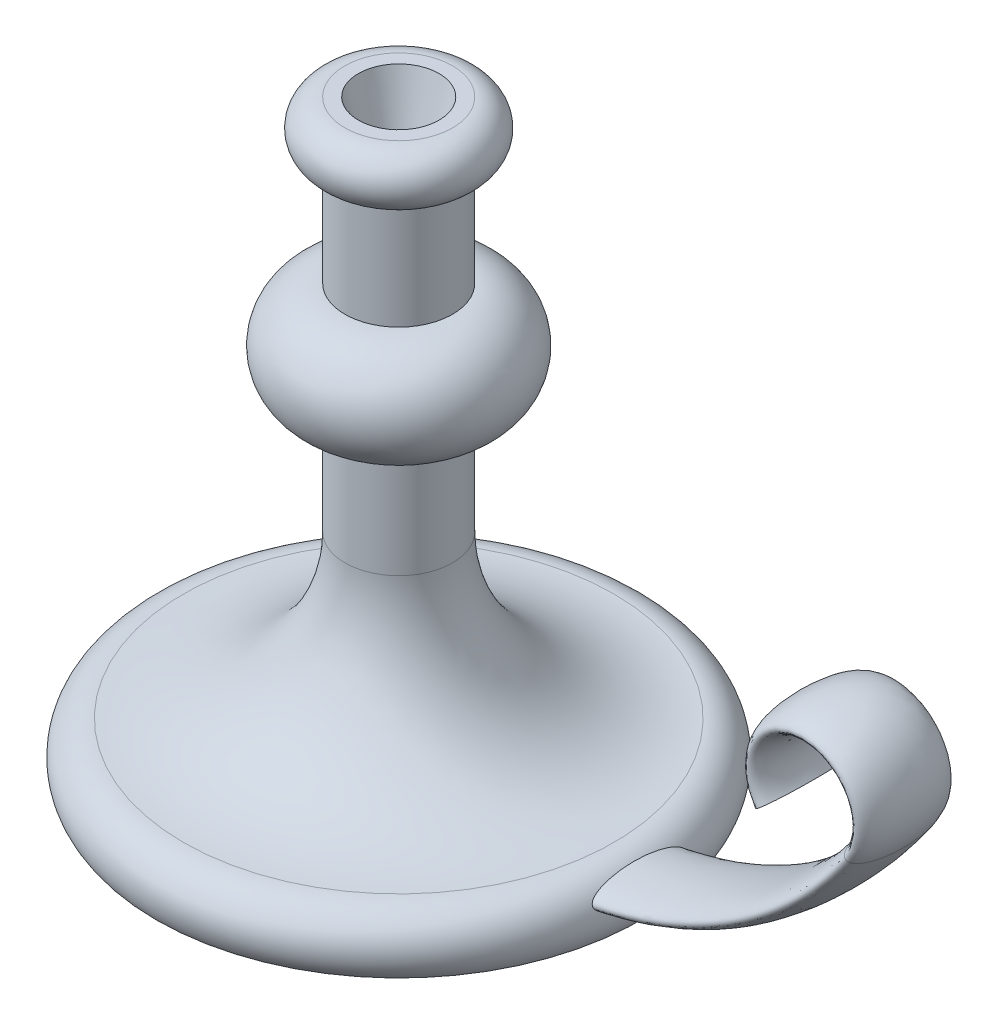
ISO-10303-21;
HEADER;
FILE_DESCRIPTION(('STEP AP214'),'2;1');
FILE_NAME('part.step','',(''),(''),'','','');
FILE_SCHEMA(('AUTOMOTIVE_DESIGN { 1 0 10303 214 1 1 1 1 }'));
ENDSEC;
DATA;
#1=APPLICATION_CONTEXT('core data for automotive mechanical design processes');
#2=APPLICATION_PROTOCOL_DEFINITION('international standard','automotive_design',2000,#1);
#3=PRODUCT_CONTEXT('',#1,'mechanical');
#4=PRODUCT('Part','Part','',(#3));
#5=PRODUCT_RELATED_PRODUCT_CATEGORY('part','',(#4));
#6=PRODUCT_DEFINITION_FORMATION('','',#4);
#7=PRODUCT_DEFINITION_CONTEXT('part definition',#1,'design');
#8=PRODUCT_DEFINITION('design','',#6,#7);
#9=PRODUCT_DEFINITION_SHAPE('','',#8);
#10=(LENGTH_UNIT() NAMED_UNIT(*) SI_UNIT(.MILLI.,.METRE.));
#11=(NAMED_UNIT(*) PLANE_ANGLE_UNIT() SI_UNIT($,.RADIAN.));
#12=(NAMED_UNIT(*) SI_UNIT($,.STERADIAN.) SOLID_ANGLE_UNIT());
#13=UNCERTAINTY_MEASURE_WITH_UNIT(LENGTH_MEASURE(1.E-05),#10,'distance_accuracy_value','');
#14=(GEOMETRIC_REPRESENTATION_CONTEXT(3) GLOBAL_UNCERTAINTY_ASSIGNED_CONTEXT((#13)) GLOBAL_UNIT_ASSIGNED_CONTEXT((#10,
#11,#12)) REPRESENTATION_CONTEXT('',''));
#15=CARTESIAN_POINT('',(0.,0.,0.));
#16=DIRECTION('',(0.,0.,1.));
#17=DIRECTION('',(1.,0.,0.));
#18=AXIS2_PLACEMENT_3D('',#15,#16,#17);
#19=CARTESIAN_POINT('',(0.,0.,0.));
#20=DIRECTION('',(0.,-1.,0.));
#21=DIRECTION('',(0.,0.,-1.));
#22=AXIS2_PLACEMENT_3D('',#19,#20,#21);
#23=PLANE('',#22);
#24=CARTESIAN_POINT('',(0.,0.,0.));
#25=DIRECTION('',(0.,-1.,0.));
#26=DIRECTION('',(0.,0.,-1.));
#27=AXIS2_PLACEMENT_3D('',#24,#25,#26);
#28=CIRCLE('',#27,90.);
#29=CARTESIAN_POINT('',(0.,0.,-90.));
#30=VERTEX_POINT('',#29);
#31=EDGE_CURVE('E82',#30,#30,#28,.T.);
#32=ORIENTED_EDGE('',*,*,#31,.T.);
#33=EDGE_LOOP('',(#32));
#34=FACE_BOUND('',#33,.T.);
#35=ADVANCED_FACE('F42',(#34),#23,.T.);
#36=CARTESIAN_POINT('',(0.,220.,0.));
#37=DIRECTION('',(0.,1.,0.));
#38=DIRECTION('',(0.,0.,1.));
#39=AXIS2_PLACEMENT_3D('',#36,#37,#38);
#40=PLANE('',#39);
#41=CARTESIAN_POINT('',(0.,220.,0.));
#42=DIRECTION('',(0.,1.,0.));
#43=DIRECTION('',(0.,0.,1.));
#44=AXIS2_PLACEMENT_3D('',#41,#42,#43);
#45=CIRCLE('',#44,15.);
#46=CARTESIAN_POINT('',(0.,220.,15.));
#47=VERTEX_POINT('',#46);
#48=EDGE_CURVE('E98',#47,#47,#45,.T.);
#49=ORIENTED_EDGE('',*,*,#48,.F.);
#50=EDGE_LOOP('',(#49));
#51=FACE_BOUND('',#50,.T.);
#52=CARTESIAN_POINT('',(0.,220.,0.));
#53=DIRECTION('',(0.,-1.,0.));
#54=DIRECTION('',(0.,0.,-1.));
#55=AXIS2_PLACEMENT_3D('',#52,#53,#54);
#56=CIRCLE('',#55,20.);
#57=CARTESIAN_POINT('',(0.,220.,-20.));
#58=VERTEX_POINT('',#57);
#59=EDGE_CURVE('E54',#58,#58,#56,.T.);
#60=ORIENTED_EDGE('',*,*,#59,.F.);
#61=EDGE_LOOP('',(#60));
#62=FACE_BOUND('',#61,.T.);
#63=ADVANCED_FACE('F105',(#51,#62),#40,.T.);
#64=CARTESIAN_POINT('',(0.,210.,0.));
#65=DIRECTION('',(0.,-1.,0.));
#66=DIRECTION('',(0.,0.,-1.));
#67=AXIS2_PLACEMENT_3D('',#64,#65,#66);
#68=TOROIDAL_SURFACE('',#67,20.,10.);
#69=ORIENTED_EDGE('',*,*,#59,.T.);
#70=EDGE_LOOP('',(#69));
#71=FACE_BOUND('',#70,.T.);
#72=CARTESIAN_POINT('',(0.,200.,0.));
#73=DIRECTION('',(0.,-1.,0.));
#74=DIRECTION('',(0.,0.,-1.));
#75=AXIS2_PLACEMENT_3D('',#72,#73,#74);
#76=CIRCLE('',#75,20.);
#77=CARTESIAN_POINT('',(0.,200.,-20.));
#78=VERTEX_POINT('',#77);
#79=EDGE_CURVE('E59',#78,#78,#76,.T.);
#80=ORIENTED_EDGE('',*,*,#79,.F.);
#81=EDGE_LOOP('',(#80));
#82=FACE_BOUND('',#81,.T.);
#83=ADVANCED_FACE('F108',(#71,#82),#68,.T.);
#84=CARTESIAN_POINT('',(0.,0.,0.));
#85=DIRECTION('',(0.,-1.,0.));
#86=DIRECTION('',(0.,0.,-1.));
#87=AXIS2_PLACEMENT_3D('',#84,#85,#86);
#88=CYLINDRICAL_SURFACE('',#87,20.);
#89=ORIENTED_EDGE('',*,*,#79,.T.);
#90=EDGE_LOOP('',(#89));
#91=FACE_BOUND('',#90,.T.);
#92=CARTESIAN_POINT('',(0.,160.,0.));
#93=DIRECTION('',(0.,-1.,0.));
#94=DIRECTION('',(0.,0.,-1.));
#95=AXIS2_PLACEMENT_3D('',#92,#93,#94);
#96=CIRCLE('',#95,20.);
#97=CARTESIAN_POINT('',(0.,160.,-20.));
#98=VERTEX_POINT('',#97);
#99=EDGE_CURVE('E64',#98,#98,#96,.T.);
#100=ORIENTED_EDGE('',*,*,#99,.F.);
#101=EDGE_LOOP('',(#100));
#102=FACE_BOUND('',#101,.T.);
#103=ADVANCED_FACE('F114',(#91,#102),#88,.T.);
#104=CARTESIAN_POINT('',(0.,140.,0.));
#105=DIRECTION('',(0.,-1.,0.));
#106=DIRECTION('',(0.,0.,-1.));
#107=AXIS2_PLACEMENT_3D('',#104,#105,#106);
#108=DEGENERATE_TOROIDAL_SURFACE('',#107,20.,20.,.T.);
#109=ORIENTED_EDGE('',*,*,#99,.T.);
#110=EDGE_LOOP('',(#109));
#111=FACE_BOUND('',#110,.T.);
#112=CARTESIAN_POINT('',(0.,120.,0.));
#113=DIRECTION('',(0.,-1.,0.));
#114=DIRECTION('',(0.,0.,-1.));
#115=AXIS2_PLACEMENT_3D('',#112,#113,#114);
#116=CIRCLE('',#115,20.);
#117=CARTESIAN_POINT('',(0.,120.,-20.));
#118=VERTEX_POINT('',#117);
#119=EDGE_CURVE('E70',#118,#118,#116,.T.);
#120=ORIENTED_EDGE('',*,*,#119,.F.);
#121=EDGE_LOOP('',(#120));
#122=FACE_BOUND('',#121,.T.);
#123=ADVANCED_FACE('F121',(#111,#122),#108,.T.);
#124=CARTESIAN_POINT('',(0.,0.,0.));
#125=DIRECTION('',(0.,-1.,0.));
#126=DIRECTION('',(0.,0.,-1.));
#127=AXIS2_PLACEMENT_3D('',#124,#125,#126);
#128=CYLINDRICAL_SURFACE('',#127,20.);
#129=ORIENTED_EDGE('',*,*,#119,.T.);
#130=EDGE_LOOP('',(#129));
#131=FACE_BOUND('',#130,.T.);
#132=CARTESIAN_POINT('',(0.,79.9999999999999,0.));
#133=DIRECTION('',(0.,-1.,0.));
#134=DIRECTION('',(0.,0.,-1.));
#135=AXIS2_PLACEMENT_3D('',#132,#133,#134);
#136=CIRCLE('',#135,20.);
#137=CARTESIAN_POINT('',(0.,79.9999999999999,-20.));
#138=VERTEX_POINT('',#137);
#139=EDGE_CURVE('E74',#138,#138,#136,.T.);
#140=ORIENTED_EDGE('',*,*,#139,.F.);
#141=EDGE_LOOP('',(#140));
#142=FACE_BOUND('',#141,.T.);
#143=ADVANCED_FACE('F125',(#131,#142),#128,.T.);
#144=CARTESIAN_POINT('',(0.,79.9999999999999,0.));
#145=DIRECTION('',(0.,-1.,0.));
#146=DIRECTION('',(0.,0.,-1.));
#147=AXIS2_PLACEMENT_3D('',#144,#145,#146);
#148=TOROIDAL_SURFACE('',#147,80.,60.);
#149=ORIENTED_EDGE('',*,*,#139,.T.);
#150=EDGE_LOOP('',(#149));
#151=FACE_BOUND('',#150,.T.);
#152=CARTESIAN_POINT('',(0.,19.9999999999999,0.));
#153=DIRECTION('',(0.,-1.,0.));
#154=DIRECTION('',(0.,0.,-1.));
#155=AXIS2_PLACEMENT_3D('',#152,#153,#154);
#156=CIRCLE('',#155,80.0000000000002);
#157=CARTESIAN_POINT('',(0.,19.9999999999999,-80.0000000000002));
#158=VERTEX_POINT('',#157);
#159=EDGE_CURVE('E78',#158,#158,#156,.T.);
#160=ORIENTED_EDGE('',*,*,#159,.F.);
#161=EDGE_LOOP('',(#160));
#162=FACE_BOUND('',#161,.T.);
#163=ADVANCED_FACE('F129',(#151,#162),#148,.F.);
#164=CARTESIAN_POINT('',(0.,7.50000000000012,0.));
#165=DIRECTION('',(0.,-1.,0.));
#166=DIRECTION('',(0.,0.,-1.));
#167=AXIS2_PLACEMENT_3D('',#164,#165,#166);
#168=TOROIDAL_SURFACE('',#167,80.0000000000003,12.4999999999998);
#169=CARTESIAN_POINT('',(89.5597422043343,12.9414346567556,-17.5));
#170=CARTESIAN_POINT('',(89.5390618403563,12.9834100865229,-17.4999996776707));
#171=CARTESIAN_POINT('',(89.5184817634661,13.0254349004938,-17.4978446678338));
#172=CARTESIAN_POINT('',(89.4776811982745,13.1092324497794,-17.4892861575811));
#173=CARTESIAN_POINT('',(89.4574608430712,13.1510050881611,-17.4828811168849));
#174=CARTESIAN_POINT('',(89.3975402811211,13.2754779151414,-17.4575154450276));
#175=CARTESIAN_POINT('',(89.3585808220615,13.357332519418,-17.4324042670614));
#176=CARTESIAN_POINT('',(89.273440780437,13.537917999339,-17.3597430943198));
#177=CARTESIAN_POINT('',(89.2281116968575,13.6353152430682,-17.3079906529225));
#178=CARTESIAN_POINT('',(89.1421567137611,13.821757010941,-17.1881654215547));
#179=CARTESIAN_POINT('',(89.1015409681602,13.9107834263932,-17.1200583326704));
#180=CARTESIAN_POINT('',(89.0298799325307,14.0690063055582,-16.9825317839868));
#181=CARTESIAN_POINT('',(88.9982856031082,14.1392491335227,-16.9145677994464));
#182=CARTESIAN_POINT('',(88.9378435588023,14.2742914925202,-16.7722502997375));
#183=CARTESIAN_POINT('',(88.9089980734783,14.3390866000317,-16.6978916893925));
#184=CARTESIAN_POINT('',(88.8536099995595,14.4639626152392,-16.5442177801531));
#185=CARTESIAN_POINT('',(88.8270733532938,14.5240313225779,-16.4648905452803));
#186=CARTESIAN_POINT('',(88.7760376587065,14.6398576639347,-16.3025863942461));
#187=CARTESIAN_POINT('',(88.751537961323,14.6956166708123,-16.2196106536441));
#188=CARTESIAN_POINT('',(88.7047328205491,14.8023169553036,-16.052427362784));
#189=CARTESIAN_POINT('',(88.6823939519367,14.8533308765833,-15.9682752160745));
#190=CARTESIAN_POINT('',(88.6391553657591,14.9521540950118,-15.7977416210759));
#191=CARTESIAN_POINT('',(88.6182558899723,14.9999628537459,-15.711359801597));
#192=CARTESIAN_POINT('',(88.557368179001,15.1392585624724,-15.4492483073625));
#193=CARTESIAN_POINT('',(88.5192579811329,15.2264609786255,-15.2707999543232));
#194=CARTESIAN_POINT('',(88.4468979005837,15.3916731276291,-14.9088289385944));
#195=CARTESIAN_POINT('',(88.4126513155028,15.4696750103546,-14.725302105289));
#196=CARTESIAN_POINT('',(88.3471391595041,15.6182965032923,-14.3538259785736));
#197=CARTESIAN_POINT('',(88.3158872528147,15.6888824046966,-14.1658608782526));
#198=CARTESIAN_POINT('',(88.2560127035518,15.8233792512431,-13.7874003918539));
#199=CARTESIAN_POINT('',(88.2273872233004,15.8872974109118,-13.5969079973402));
#200=CARTESIAN_POINT('',(88.172334882745,16.0094159388249,-13.213849673779));
#201=CARTESIAN_POINT('',(88.1459074726897,16.0676177374301,-13.021284276893));
#202=CARTESIAN_POINT('',(88.0884248304703,16.1932687928886,-12.5849658119247));
#203=CARTESIAN_POINT('',(88.0579162002185,16.2592725226906,-12.3407253521734));
#204=CARTESIAN_POINT('',(87.9994625659015,16.3844358500306,-11.8501803460781));
#205=CARTESIAN_POINT('',(87.971517823409,16.4435947494062,-11.6038755919222));
#206=CARTESIAN_POINT('',(87.9178897421859,16.5558889779776,-11.1095299870479));
#207=CARTESIAN_POINT('',(87.892207511427,16.6090213595568,-10.8614883492399));
#208=CARTESIAN_POINT('',(87.8429155378604,16.7098546386226,-10.3640943607017));
#209=CARTESIAN_POINT('',(87.8193058942813,16.7575552760879,-10.114741947821));
#210=CARTESIAN_POINT('',(87.7514718906048,16.8930622945828,-9.36631396644894));
#211=CARTESIAN_POINT('',(87.7101114199142,16.97354616682,-8.86564202060308));
#212=CARTESIAN_POINT('',(87.6344118706355,17.1178657179369,-7.86153551840223));
#213=CARTESIAN_POINT('',(87.6000713341081,17.181704854449,-7.35810155802558));
#214=CARTESIAN_POINT('',(87.5383679228556,17.2943697092708,-6.35225136111868));
#215=CARTESIAN_POINT('',(87.510963905082,17.3432843238913,-5.84984753787551));
#216=CARTESIAN_POINT('',(87.4628391630612,17.4279603163538,-4.84354228831006));
#217=CARTESIAN_POINT('',(87.4421195253374,17.4637195559667,-4.33964063194085));
#218=CARTESIAN_POINT('',(87.4074386787956,17.5229738360405,-3.33084363886009));
#219=CARTESIAN_POINT('',(87.3934780874883,17.5464677559496,-2.82594821558677));
#220=CARTESIAN_POINT('',(87.3724154174236,17.5817273168609,-1.81615213380799));
#221=CARTESIAN_POINT('',(87.365305974734,17.5935055508652,-1.31125206554517));
#222=CARTESIAN_POINT('',(87.3579750479626,17.605648406649,-0.30131830913287));
#223=CARTESIAN_POINT('',(87.3577528582351,17.6060141977103,0.203715360026129));
#224=CARTESIAN_POINT('',(87.364196342644,17.5953454261039,1.21356726554173));
#225=CARTESIAN_POINT('',(87.3708612610897,17.5843121142069,1.71838551945512));
#226=CARTESIAN_POINT('',(87.3886163883339,17.5546163065411,2.60695068649856));
#227=CARTESIAN_POINT('',(87.3982690399214,17.5384060734754,2.99081046478842));
#228=CARTESIAN_POINT('',(87.4214966880661,17.4990063104014,3.75807002785715));
#229=CARTESIAN_POINT('',(87.4350718235982,17.4758165331044,4.14146979585431));
#230=CARTESIAN_POINT('',(87.4661109016123,17.4221255760208,4.90767543763212));
#231=CARTESIAN_POINT('',(87.4835755913651,17.3916229911934,5.29048118303762));
#232=CARTESIAN_POINT('',(87.5224765269601,17.3226675403927,6.05728766608039));
#233=CARTESIAN_POINT('',(87.5439339089185,17.2841722314847,6.44128353835444));
#234=CARTESIAN_POINT('',(87.5907685418078,17.1987228636429,7.20803081067559));
#235=CARTESIAN_POINT('',(87.6161451191907,17.1517702579396,7.59078241304233));
#236=CARTESIAN_POINT('',(87.670887524493,17.0486132676473,8.35453102594117));
#237=CARTESIAN_POINT('',(87.7002509792865,16.9924143825779,8.73552894189138));
#238=CARTESIAN_POINT('',(87.7555693385743,16.8844873931685,9.40362807317348));
#239=CARTESIAN_POINT('',(87.7806318626292,16.8349635590469,9.69115955865564));
#240=CARTESIAN_POINT('',(87.8333287645209,16.7293167465829,10.2648242071223));
#241=CARTESIAN_POINT('',(87.8609635304673,16.6731927720484,10.5509571522123));
#242=CARTESIAN_POINT('',(87.919067813825,16.5534902310351,11.1217112831612));
#243=CARTESIAN_POINT('',(87.9495404231885,16.4899035134826,11.4063304543325));
#244=CARTESIAN_POINT('',(88.0137266324377,16.3541216812727,11.9738772339477));
#245=CARTESIAN_POINT('',(88.0474477220509,16.2819065762202,12.2567992545898));
#246=CARTESIAN_POINT('',(88.1183718381955,16.1280994435204,12.8175821097588));
#247=CARTESIAN_POINT('',(88.1555499028385,16.046573796357,13.0954641920682));
#248=CARTESIAN_POINT('',(88.2343580118386,15.8719007074314,13.6468218234687));
#249=CARTESIAN_POINT('',(88.275985729586,15.7787593350285,13.9202995902182));
#250=CARTESIAN_POINT('',(88.3426568223941,15.628384040649,14.3254052817092));
#251=CARTESIAN_POINT('',(88.3655500017786,15.5765627213432,14.4594023169281));
#252=CARTESIAN_POINT('',(88.4129882653634,15.4688611687535,14.7254525655375));
#253=CARTESIAN_POINT('',(88.4375331689952,15.4129813790936,14.8575059894887));
#254=CARTESIAN_POINT('',(88.4884967907574,15.2967269720351,15.1188747284344));
#255=CARTESIAN_POINT('',(88.514910912316,15.2363633637366,15.248195809858));
#256=CARTESIAN_POINT('',(88.5700241751773,15.1103179001212,15.5037035642082));
#257=CARTESIAN_POINT('',(88.5987227483178,15.0446373670989,15.6298910063173));
#258=CARTESIAN_POINT('',(88.6570151826479,14.9113179601609,15.8704199707059));
#259=CARTESIAN_POINT('',(88.6864417367862,14.8440563407289,15.9850095995261));
#260=CARTESIAN_POINT('',(88.7482816567769,14.7030103830827,16.2094581395952));
#261=CARTESIAN_POINT('',(88.7806974756142,14.6292206899981,16.3193130551169));
#262=CARTESIAN_POINT('',(88.8489097184973,14.4745639616531,16.5315146626623));
#263=CARTESIAN_POINT('',(88.8846785573509,14.3937550191611,16.6339121024916));
#264=CARTESIAN_POINT('',(88.9606113704154,14.2232561160767,16.8291907541922));
#265=CARTESIAN_POINT('',(89.0007675950255,14.1335818404865,16.9220882016583));
#266=CARTESIAN_POINT('',(89.0601235459874,14.0021924630805,17.0411637727684));
#267=CARTESIAN_POINT('',(89.0770574086406,13.9648250339927,17.073294917827));
#268=CARTESIAN_POINT('',(89.111770404309,13.8885105828123,17.1351129203988));
#269=CARTESIAN_POINT('',(89.1295494802,13.8495636674962,17.1647999427301));
#270=CARTESIAN_POINT('',(89.1842722230349,13.7301865324198,17.2496672583031));
#271=CARTESIAN_POINT('',(89.2225929343978,13.6472387371287,17.3006362954167));
#272=CARTESIAN_POINT('',(89.2830198855206,13.5177923286577,17.3659392171784));
#273=CARTESIAN_POINT('',(89.3038035106327,13.4734899832391,17.385944655127));
#274=CARTESIAN_POINT('',(89.3462357272132,13.3835498526412,17.421521231844));
#275=CARTESIAN_POINT('',(89.3678838017237,13.3379128698458,17.4370949768747));
#276=CARTESIAN_POINT('',(89.4119048024241,13.2456714845448,17.4633118273198));
#277=CARTESIAN_POINT('',(89.4342765183817,13.1990687398024,17.4739627514632));
#278=CARTESIAN_POINT('',(89.4796070415908,13.1052444737537,17.4900003628641));
#279=CARTESIAN_POINT('',(89.502565762481,13.0580230439623,17.495387819971));
#280=CARTESIAN_POINT('',(89.546427171602,12.9684112208445,17.5004320668286));
#281=CARTESIAN_POINT('',(89.5672934245653,12.9260327119427,17.5006298436875));
#282=CARTESIAN_POINT('',(89.6091580078858,12.8415284156484,17.496667300483));
#283=CARTESIAN_POINT('',(89.630156379747,12.7994027167222,17.4925055351934));
#284=CARTESIAN_POINT('',(89.6721156351432,12.7157496198108,17.479965082583));
#285=CARTESIAN_POINT('',(89.693076501433,12.6742224548789,17.4715847960013));
#286=CARTESIAN_POINT('',(89.7348115258835,12.5920532516239,17.450862522026));
#287=CARTESIAN_POINT('',(89.7555855765782,12.5514117057389,17.4385183877269));
#288=CARTESIAN_POINT('',(89.8013847331779,12.4623676182577,17.407062698976));
#289=CARTESIAN_POINT('',(89.8263321178976,12.4142402057079,17.3870577635768));
#290=CARTESIAN_POINT('',(89.8756026524764,12.319894282953,17.3423007335127));
#291=CARTESIAN_POINT('',(89.8999253272693,12.2736772101064,17.317545140678));
#292=CARTESIAN_POINT('',(89.9718636752116,12.1379719567039,17.2371059859825));
#293=CARTESIAN_POINT('',(90.0184026508769,12.051520920799,17.1752845379973));
#294=CARTESIAN_POINT('',(90.1015176697339,11.8991704299987,17.0502729237444));
#295=CARTESIAN_POINT('',(90.1385373685486,11.832138329749,16.9886971231214));
#296=CARTESIAN_POINT('',(90.210486932928,11.7032426034952,16.8591573255862));
#297=CARTESIAN_POINT('',(90.24541514088,11.641383062009,16.7911883686367));
#298=CARTESIAN_POINT('',(90.3133841124367,11.5222099067343,16.6502911436158));
#299=CARTESIAN_POINT('',(90.3464212107126,11.4649050425001,16.5773538074551));
#300=CARTESIAN_POINT('',(90.4107258034176,11.3544143267813,16.427734996584));
#301=CARTESIAN_POINT('',(90.441993749758,11.3012274221163,16.3510544874358));
#302=CARTESIAN_POINT('',(90.5066142435689,11.1922810586097,16.185318952537));
#303=CARTESIAN_POINT('',(90.539765249564,11.1369814833086,16.0958847835331));
#304=CARTESIAN_POINT('',(90.6043042941243,11.0303194621558,15.9140859303206));
#305=CARTESIAN_POINT('',(90.6356921559876,10.978957410734,15.8217209538336));
#306=CARTESIAN_POINT('',(90.6968383877972,10.8797698841651,15.6347974994414));
#307=CARTESIAN_POINT('',(90.7265992701637,10.8319389137698,15.540242744142));
#308=CARTESIAN_POINT('',(90.7846969346252,10.7393295137681,15.3492353522605));
#309=CARTESIAN_POINT('',(90.8130337948205,10.6945509167067,15.2527828201664));
#310=CARTESIAN_POINT('',(90.877121220524,10.5940589597549,15.0277319837683));
#311=CARTESIAN_POINT('',(90.9124022819659,10.5393328792866,14.8985593440141));
#312=CARTESIAN_POINT('',(90.9809741103802,10.4339610325184,14.6380328432609));
#313=CARTESIAN_POINT('',(91.0142645951403,10.3833158444318,14.5066786763347));
#314=CARTESIAN_POINT('',(91.1115171918214,10.2366440116077,14.1096810918781));
#315=CARTESIAN_POINT('',(91.1727828792967,10.1460018602115,13.8413800425919));
#316=CARTESIAN_POINT('',(91.2892862812461,9.97615455726917,13.2997906638459));
#317=CARTESIAN_POINT('',(91.3445203789089,9.89695625887039,13.0264994554536));
#318=CARTESIAN_POINT('',(91.4499805719981,9.74769654866268,12.4748594155948));
#319=CARTESIAN_POINT('',(91.5001780442573,9.67768673078022,12.1964912536698));
#320=CARTESIAN_POINT('',(91.5957501918069,9.54592534416391,11.6372393425744));
#321=CARTESIAN_POINT('',(91.6411285723795,9.48416742117633,11.3563577087906));
#322=CARTESIAN_POINT('',(91.7275132616965,9.36779787162552,10.7925089006676));
#323=CARTESIAN_POINT('',(91.7685202729421,9.31318509647928,10.5095420692682));
#324=CARTESIAN_POINT('',(91.8503345045438,9.2052050871181,9.91387150213596));
#325=CARTESIAN_POINT('',(91.8907217744489,9.15249390095815,9.60099168323576));
#326=CARTESIAN_POINT('',(91.966921819911,9.05389158705536,8.97359688181911));
#327=CARTESIAN_POINT('',(92.0027343661631,9.00800080116141,8.65908181815886));
#328=CARTESIAN_POINT('',(92.0700329889401,8.92240020575311,8.0286556880872));
#329=CARTESIAN_POINT('',(92.101517751625,8.88269227276199,7.71274422766436));
#330=CARTESIAN_POINT('',(92.1603325838504,8.80898713679309,7.07986626810553));
#331=CARTESIAN_POINT('',(92.187662500542,8.77499014390504,6.76289973059341));
#332=CARTESIAN_POINT('',(92.2635030013651,8.68114273902102,5.81249868362177));
#333=CARTESIAN_POINT('',(92.3060517448554,8.62919999492195,5.17778747193802));
#334=CARTESIAN_POINT('',(92.3760091017525,8.54431318450693,3.90627938186781));
#335=CARTESIAN_POINT('',(92.4034169750229,8.5113700469519,3.26948240305244));
#336=CARTESIAN_POINT('',(92.4435085691828,8.46331702284121,1.99545741778401));
#337=CARTESIAN_POINT('',(92.4562084043366,8.44818761908849,1.35823064985376));
#338=CARTESIAN_POINT('',(92.4671302630247,8.43517103988554,0.0834423270811082));
#339=CARTESIAN_POINT('',(92.465351427176,8.43728488791034,-0.554119245387755));
#340=CARTESIAN_POINT('',(92.4472853754494,8.45883344750923,-1.82886328296955));
#341=CARTESIAN_POINT('',(92.4309954438925,8.47827140120329,-2.46604565478067));
#342=CARTESIAN_POINT('',(92.3836590626411,8.53514174464794,-3.73902583866975));
#343=CARTESIAN_POINT('',(92.3526140808134,8.5725723444522,-4.37482378215475));
#344=CARTESIAN_POINT('',(92.2921790866405,8.64621329194995,-5.3662554446095));
#345=CARTESIAN_POINT('',(92.268011823561,8.67578736963479,-5.72271555901837));
#346=CARTESIAN_POINT('',(92.2147013952356,8.74146404735389,-6.43465819603267));
#347=CARTESIAN_POINT('',(92.1855583836335,8.77756644580536,-6.79014074847947));
#348=CARTESIAN_POINT('',(92.1221127048894,8.85679311513347,-7.49983836059448));
#349=CARTESIAN_POINT('',(92.087810395755,8.89991689880818,-7.8540535064643));
#350=CARTESIAN_POINT('',(92.0137981226251,8.99384143269645,-8.56089767223884));
#351=CARTESIAN_POINT('',(91.974088334396,9.04464193338978,-8.91352674331308));
#352=CARTESIAN_POINT('',(91.9015818240065,9.13842562293714,-9.51226790233081));
#353=CARTESIAN_POINT('',(91.8702370654073,9.17924629619432,-9.75889575934168));
#354=CARTESIAN_POINT('',(91.8045624920059,9.26550036635908,-10.2509419620299));
#355=CARTESIAN_POINT('',(91.7702327567072,9.31093364041765,-10.4963603397373));
#356=CARTESIAN_POINT('',(91.6984266463273,9.40685898724878,-10.9855805665733));
#357=CARTESIAN_POINT('',(91.6609523533818,9.45734771681962,-11.2293833718164));
#358=CARTESIAN_POINT('',(91.5826038967893,9.56401317099021,-11.7151775621045));
#359=CARTESIAN_POINT('',(91.5417298772537,9.62018965451309,-11.9571690234573));
#360=CARTESIAN_POINT('',(91.4386423376747,9.76351210996378,-12.5384162018482));
#361=CARTESIAN_POINT('',(91.374585890329,9.85386844470741,-12.8765786557769));
#362=CARTESIAN_POINT('',(91.2720163238268,10.0014015523806,-13.379313604131));
#363=CARTESIAN_POINT('',(91.2367090969994,10.0526332971693,-13.5462966135005));
#364=CARTESIAN_POINT('',(91.1637294936458,10.1596261841618,-13.8782853379553));
#365=CARTESIAN_POINT('',(91.1260572231723,10.2153871233019,-14.0432911413072));
#366=CARTESIAN_POINT('',(91.0448513753998,10.3369382727868,-14.3844416693127));
#367=CARTESIAN_POINT('',(91.0010908407916,10.4031767890598,-14.5603739146113));
#368=CARTESIAN_POINT('',(90.9100440331647,10.5428509324198,-14.908531165983));
#369=CARTESIAN_POINT('',(90.8627565865347,10.6162889577863,-15.0807549132313));
#370=CARTESIAN_POINT('',(90.7642492199856,10.7715651970481,-15.4195496037302));
#371=CARTESIAN_POINT('',(90.7130423069868,10.8533759065568,-15.5861368065584));
#372=CARTESIAN_POINT('',(90.6058220172114,11.0275348916429,-15.9120386126948));
#373=CARTESIAN_POINT('',(90.5498128203453,11.1198740259081,-16.0713593593323));
#374=CARTESIAN_POINT('',(90.4444082893052,11.2969255920341,-16.346591008204));
#375=CARTESIAN_POINT('',(90.3961277047706,11.3791055101425,-16.4645448336189));
#376=CARTESIAN_POINT('',(90.2950977924849,11.5538633486867,-16.6911566146551));
#377=CARTESIAN_POINT('',(90.2423390562532,11.6464633011954,-16.7997939840166));
#378=CARTESIAN_POINT('',(90.1590440243457,11.7953014200273,-16.9524870890686));
#379=CARTESIAN_POINT('',(90.1303607600849,11.8469859215398,-17.0019977189781));
#380=CARTESIAN_POINT('',(90.0716181087376,11.953827456151,-17.0963102611099));
#381=CARTESIAN_POINT('',(90.0415584049396,12.0089852895524,-17.1411110817339));
#382=CARTESIAN_POINT('',(89.9801756575597,12.122724663209,-17.2246441347398));
#383=CARTESIAN_POINT('',(89.9488577537652,12.1812926416249,-17.2633984155372));
#384=CARTESIAN_POINT('',(89.884954967133,12.3020144005062,-17.3335784406431));
#385=CARTESIAN_POINT('',(89.8523712452276,12.3641649194656,-17.3650107233704));
#386=CARTESIAN_POINT('',(89.7981176909036,12.4687258013536,-17.4092508881815));
#387=CARTESIAN_POINT('',(89.7767436177657,12.5101841078546,-17.4246893204628));
#388=CARTESIAN_POINT('',(89.7336969050676,12.5942336377178,-17.4515182330193));
#389=CARTESIAN_POINT('',(89.7120243813913,12.636824427018,-17.4629102408532));
#390=CARTESIAN_POINT('',(89.6685521390584,12.7228207531292,-17.4812886417918));
#391=CARTESIAN_POINT('',(89.6467526103348,12.766225219827,-17.488280453409));
#392=CARTESIAN_POINT('',(89.6031794397248,12.8535466229688,-17.4976362320133));
#393=CARTESIAN_POINT('',(89.5814057970824,12.8974635440192,-17.5000003376542));
#394=CARTESIAN_POINT('',(89.5597422043343,12.9414346567556,-17.5));
#395=B_SPLINE_CURVE_WITH_KNOTS('',3,(#169,#170,#171,#172,#173,#174,#175,#176,#177,#178,#179,
#180,#181,#182,#183,#184,#185,#186,#187,#188,#189,#190,#191,#192,#193,#194,#195,#196,#197,#198,
#199,#200,#201,#202,#203,#204,#205,#206,#207,#208,#209,#210,#211,#212,#213,#214,#215,#216,#217,
#218,#219,#220,#221,#222,#223,#224,#225,#226,#227,#228,#229,#230,#231,#232,#233,#234,#235,#236,
#237,#238,#239,#240,#241,#242,#243,#244,#245,#246,#247,#248,#249,#250,#251,#252,#253,#254,#255,
#256,#257,#258,#259,#260,#261,#262,#263,#264,#265,#266,#267,#268,#269,#270,#271,#272,#273,#274,
#275,#276,#277,#278,#279,#280,#281,#282,#283,#284,#285,#286,#287,#288,#289,#290,#291,#292,#293,
#294,#295,#296,#297,#298,#299,#300,#301,#302,#303,#304,#305,#306,#307,#308,#309,#310,#311,#312,
#313,#314,#315,#316,#317,#318,#319,#320,#321,#322,#323,#324,#325,#326,#327,#328,#329,#330,#331,
#332,#333,#334,#335,#336,#337,#338,#339,#340,#341,#342,#343,#344,#345,#346,#347,#348,#349,#350,
#351,#352,#353,#354,#355,#356,#357,#358,#359,#360,#361,#362,#363,#364,#365,#366,#367,#368,#369,
#370,#371,#372,#373,#374,#375,#376,#377,#378,#379,#380,#381,#382,#383,#384,#385,#386,#387,#388,
#389,#390,#391,#392,#393,#394),.UNSPECIFIED.,.T.,.F.,(4,2,2,2,2,2,2,2,2,2,2,2,2,2,2,2,2,2,2,2,2,
2,2,2,2,2,2,2,2,2,2,2,2,2,2,2,2,2,2,2,2,2,2,2,2,2,2,2,2,2,2,2,2,2,2,2,2,2,2,2,2,2,2,2,2,2,2,2,2,
2,2,2,2,2,2,2,2,2,2,2,2,2,2,2,2,2,2,2,2,2,2,2,2,2,2,2,2,2,2,2,2,2,2,2,2,2,2,2,2,2,2,2,4),(0.,
0.140326879649312,0.280704643844313,0.561461806499953,0.917225717585813,1.27374235386084,
1.58146302398147,1.88943119593642,2.19816989275475,2.50680983170026,2.8094429237275,
3.11212672643257,3.71838915770194,4.32516518168248,4.93458970782545,5.54334784093539,
6.15195325906651,6.91631911029048,7.6807628570709,8.44557890144729,9.21043154271134,
10.7363530227228,12.2619572680851,13.7782885580524,15.2948661984783,16.8115823682402,
18.3266664767785,19.8415953542036,21.3563580231469,22.5092504482308,23.6621837256809,
24.8153386988898,25.9747813799631,27.1340250219354,28.2925816429425,29.1710242088839,
30.0495995331114,30.9291435591542,31.8107663507034,32.6864555684207,33.5616891298976,
33.9980703124477,34.4344038665403,34.8696994156046,35.304887039303,35.7129485465613,
36.1213479397352,36.5266413619584,36.9312301321629,37.087481072601,37.2437214677037,
37.5562829439449,37.7147148343191,37.8730533580126,38.0311395270883,38.1892025705741,
38.3307149014328,38.4722741597123,38.6138871242241,38.7555769191151,38.9286541005773,
39.1018592207181,39.4485901352339,39.7429975955386,40.0376353818191,40.3328261359407,
40.6279411430422,40.9585479808935,41.2891878931729,41.6193018978016,41.949397777569,
42.3832551508599,42.8171738887969,43.6859467918768,44.5552378220701,45.4292182663362,
46.302521787528,47.1756847521811,48.1351081860332,49.0945796914522,50.0543418354862,
51.0141392787934,52.9283366636011,54.8426276125085,56.7548192562812,58.6671243992164,
60.5797874956864,62.4922603557697,63.5676819321848,64.6430703071874,65.7183840946027,
66.7936629380623,67.5494303160602,68.305177570719,69.0604283053776,69.8156470419352,
70.8826765887351,71.4172057561798,71.9517109715328,72.5305894861726,73.1096614946433,
73.6868888443992,74.2636187787012,74.7180950553375,75.1735510009089,75.4046853668801,
75.6358731855895,75.8661972266865,76.0963147970917,76.2435550398534,76.3907396389802,
76.5377426347989,76.6847412260986),.UNSPECIFIED.);
#396=CARTESIAN_POINT('',(89.5597422043343,12.9414346567556,-17.5));
#397=VERTEX_POINT('',#396);
#398=EDGE_CURVE('E10',#397,#397,#395,.T.);
#399=ORIENTED_EDGE('',*,*,#398,.F.);
#400=EDGE_LOOP('',(#399));
#401=FACE_BOUND('',#400,.T.);
#402=ORIENTED_EDGE('',*,*,#159,.T.);
#403=EDGE_LOOP('',(#402));
#404=FACE_BOUND('',#403,.T.);
#405=ORIENTED_EDGE('',*,*,#31,.F.);
#406=EDGE_LOOP('',(#405));
#407=FACE_BOUND('',#406,.T.);
#408=ADVANCED_FACE('F132',(#401,#404,#407),#168,.T.);
#409=CARTESIAN_POINT('',(150.634185358261,75.,0.));
#410=DIRECTION('',(0.566666666666666,-0.823947139620552,0.));
#411=DIRECTION('',(0.,0.,-1.));
#412=AXIS2_PLACEMENT_3D('',#409,#410,#411);
#413=PLANE('',#412);
#414=CARTESIAN_POINT('',(150.634185358261,75.,0.));
#415=DIRECTION('',(0.566666666666666,-0.823947139620552,0.));
#416=DIRECTION('',(0.,0.,-1.));
#417=AXIS2_PLACEMENT_3D('',#414,#415,#416);
#418=ELLIPSE('',#417,17.5,5.);
#419=CARTESIAN_POINT('',(150.634185358261,75.,-17.5));
#420=VERTEX_POINT('',#419);
#421=EDGE_CURVE('E86',#420,#420,#418,.T.);
#422=ORIENTED_EDGE('',*,*,#421,.T.);
#423=EDGE_LOOP('',(#422));
#424=FACE_BOUND('',#423,.T.);
#425=ADVANCED_FACE('F137',(#424),#413,.T.);
#426=CARTESIAN_POINT('',(60.,10.,-17.5));
#427=CARTESIAN_POINT('',(110.410191303973,10.,-17.5));
#428=CARTESIAN_POINT('',(155.026295870831,33.4646670673665,-17.5));
#429=CARTESIAN_POINT('',(183.592070943083,75.,-17.5));
#430=CARTESIAN_POINT('',(60.,20.,-17.5));
#431=CARTESIAN_POINT('',(107.049511883708,20.,-17.5));
#432=CARTESIAN_POINT('',(148.691209479443,41.9003559295421,-17.5));
#433=CARTESIAN_POINT('',(175.352599546877,80.6666666666666,-17.5));
#434=CARTESIAN_POINT('',(60.,20.,17.5));
#435=CARTESIAN_POINT('',(107.049511883708,20.,17.5));
#436=CARTESIAN_POINT('',(148.691209479443,41.9003559295421,17.5));
#437=CARTESIAN_POINT('',(175.352599546877,80.6666666666666,17.5));
#438=CARTESIAN_POINT('',(60.,10.,17.5));
#439=CARTESIAN_POINT('',(110.410191303973,10.,17.5));
#440=CARTESIAN_POINT('',(155.026295870831,33.4646670673665,17.5));
#441=CARTESIAN_POINT('',(183.592070943083,75.,17.5));
#442=CARTESIAN_POINT('',(60.,0.,17.5));
#443=CARTESIAN_POINT('',(113.770870724238,0.,17.5));
#444=CARTESIAN_POINT('',(161.36138226222,25.0289782051909,17.5));
#445=CARTESIAN_POINT('',(191.831542339288,69.3333333333333,17.5));
#446=CARTESIAN_POINT('',(60.,0.,-17.5));
#447=CARTESIAN_POINT('',(113.770870724238,0.,-17.5));
#448=CARTESIAN_POINT('',(161.36138226222,25.0289782051909,-17.5));
#449=CARTESIAN_POINT('',(191.831542339288,69.3333333333333,-17.5));
#450=CARTESIAN_POINT('',(60.,10.,-17.5));
#451=CARTESIAN_POINT('',(110.410191303973,10.,-17.5));
#452=CARTESIAN_POINT('',(155.026295870831,33.4646670673665,-17.5));
#453=CARTESIAN_POINT('',(183.592070943083,75.,-17.5));
#454=(BOUNDED_SURFACE() B_SPLINE_SURFACE(3,3,((#426,#427,#428,#429),(#430,#431,#432,#433),(#434,
#435,#436,#437),(#438,#439,#440,#441),(#442,#443,#444,#445),(#446,#447,#448,#449),(#450,#451,
#452,#453)),.UNSPECIFIED.,.T.,.F.,.F.) B_SPLINE_SURFACE_WITH_KNOTS((4,3,4),(4,4),(0.,0.5,1.),
(0.,1.),.UNSPECIFIED.) GEOMETRIC_REPRESENTATION_ITEM() RATIONAL_B_SPLINE_SURFACE(((1.,
0.923374135437856,0.923374135437856,1.),(0.333333333333333,0.307791378479285,0.307791378479285,
0.333333333333333),(0.333333333333333,0.307791378479285,0.307791378479285,0.333333333333333),
(1.,0.923374135437856,0.923374135437856,1.),(0.333333333333333,0.307791378479285,
0.307791378479285,0.333333333333333),(0.333333333333333,0.307791378479285,0.307791378479285,
0.333333333333333),(1.,0.923374135437856,0.923374135437856,1.))) REPRESENTATION_ITEM('') SURFACE());
#455=CARTESIAN_POINT('',(183.592070943083,75.,0.));
#456=DIRECTION('',(0.566666666666667,0.823947139620552,0.));
#457=DIRECTION('',(0.,0.,-1.));
#458=AXIS2_PLACEMENT_3D('',#455,#456,#457);
#459=ELLIPSE('',#458,17.5,5.);
#460=CARTESIAN_POINT('',(183.592070943083,75.,-17.5));
#461=VERTEX_POINT('',#460);
#462=EDGE_CURVE('E90',#461,#461,#459,.T.);
#463=ORIENTED_EDGE('',*,*,#398,.T.);
#464=EDGE_LOOP('',(#463));
#465=FACE_BOUND('',#464,.T.);
#466=ORIENTED_EDGE('',*,*,#462,.F.);
#467=EDGE_LOOP('',(#466));
#468=FACE_BOUND('',#467,.T.);
#469=ADVANCED_FACE('F142',(#465,#468),#454,.T.);
#470=CARTESIAN_POINT('',(183.592070943083,75.,-17.5));
#471=CARTESIAN_POINT('',(193.981461744242,90.10642735238,-17.5));
#472=CARTESIAN_POINT('',(185.447347211541,106.333333333333,-17.5));
#473=CARTESIAN_POINT('',(167.113128150672,106.333333333333,-17.5));
#474=CARTESIAN_POINT('',(148.778909089802,106.333333333333,-17.5));
#475=CARTESIAN_POINT('',(140.244794557101,90.1064273523801,-17.5));
#476=CARTESIAN_POINT('',(150.634185358261,75.,-17.5));
#477=CARTESIAN_POINT('',(175.352599546877,80.6666666666667,-17.5));
#478=CARTESIAN_POINT('',(180.547294947457,88.2198803428567,-17.5));
#479=CARTESIAN_POINT('',(176.280237681107,96.3333333333333,-17.5));
#480=CARTESIAN_POINT('',(167.113128150672,96.3333333333333,-17.5));
#481=CARTESIAN_POINT('',(157.946018620237,96.3333333333333,-17.5));
#482=CARTESIAN_POINT('',(153.678961353887,88.2198803428567,-17.5));
#483=CARTESIAN_POINT('',(158.873656754466,80.6666666666667,-17.5));
#484=CARTESIAN_POINT('',(175.352599546877,80.6666666666667,17.5));
#485=CARTESIAN_POINT('',(180.547294947457,88.2198803428567,17.5));
#486=CARTESIAN_POINT('',(176.280237681107,96.3333333333333,17.5));
#487=CARTESIAN_POINT('',(167.113128150672,96.3333333333333,17.5));
#488=CARTESIAN_POINT('',(157.946018620237,96.3333333333333,17.5));
#489=CARTESIAN_POINT('',(153.678961353887,88.2198803428567,17.5));
#490=CARTESIAN_POINT('',(158.873656754466,80.6666666666667,17.5));
#491=CARTESIAN_POINT('',(183.592070943083,75.,17.5));
#492=CARTESIAN_POINT('',(193.981461744242,90.10642735238,17.5));
#493=CARTESIAN_POINT('',(185.447347211541,106.333333333333,17.5));
#494=CARTESIAN_POINT('',(167.113128150672,106.333333333333,17.5));
#495=CARTESIAN_POINT('',(148.778909089802,106.333333333333,17.5));
#496=CARTESIAN_POINT('',(140.244794557101,90.1064273523801,17.5));
#497=CARTESIAN_POINT('',(150.634185358261,75.,17.5));
#498=CARTESIAN_POINT('',(191.831542339288,69.3333333333333,17.5));
#499=CARTESIAN_POINT('',(207.415628541028,91.9929743619034,17.5));
#500=CARTESIAN_POINT('',(194.614456741976,116.333333333333,17.5));
#501=CARTESIAN_POINT('',(167.113128150672,116.333333333333,17.5));
#502=CARTESIAN_POINT('',(139.611799559367,116.333333333333,17.5));
#503=CARTESIAN_POINT('',(126.810627760316,91.9929743619035,17.5));
#504=CARTESIAN_POINT('',(142.394713962055,69.3333333333334,17.5));
#505=CARTESIAN_POINT('',(191.831542339288,69.3333333333333,-17.5));
#506=CARTESIAN_POINT('',(207.415628541028,91.9929743619034,-17.5));
#507=CARTESIAN_POINT('',(194.614456741976,116.333333333333,-17.5));
#508=CARTESIAN_POINT('',(167.113128150672,116.333333333333,-17.5));
#509=CARTESIAN_POINT('',(139.611799559367,116.333333333333,-17.5));
#510=CARTESIAN_POINT('',(126.810627760316,91.9929743619035,-17.5));
#511=CARTESIAN_POINT('',(142.394713962055,69.3333333333334,-17.5));
#512=CARTESIAN_POINT('',(183.592070943083,75.,-17.5));
#513=CARTESIAN_POINT('',(193.981461744242,90.10642735238,-17.5));
#514=CARTESIAN_POINT('',(185.447347211541,106.333333333333,-17.5));
#515=CARTESIAN_POINT('',(167.113128150672,106.333333333333,-17.5));
#516=CARTESIAN_POINT('',(148.778909089802,106.333333333333,-17.5));
#517=CARTESIAN_POINT('',(140.244794557101,90.1064273523801,-17.5));
#518=CARTESIAN_POINT('',(150.634185358261,75.,-17.5));
#519=(BOUNDED_SURFACE() B_SPLINE_SURFACE(3,3,((#470,#471,#472,#473,#474,#475,#476),(#477,#478,
#479,#480,#481,#482,#483),(#484,#485,#486,#487,#488,#489,#490),(#491,#492,#493,#494,#495,#496,
#497),(#498,#499,#500,#501,#502,#503,#504),(#505,#506,#507,#508,#509,#510,#511),(#512,#513,#514,
#515,#516,#517,#518)),.UNSPECIFIED.,.T.,.F.,.F.) B_SPLINE_SURFACE_WITH_KNOTS((4,3,4),(4,3,4),
(0.,0.5,1.),(0.,0.5,1.),
.UNSPECIFIED.) GEOMETRIC_REPRESENTATION_ITEM() RATIONAL_B_SPLINE_SURFACE(((1.,0.643649778750421,
0.643649778750421,1.,0.643649778750421,0.643649778750421,1.),(0.333333333333333,
0.21454992625014,0.21454992625014,0.333333333333333,0.21454992625014,0.21454992625014,
0.333333333333333),(0.333333333333333,0.21454992625014,0.21454992625014,0.333333333333333,
0.21454992625014,0.21454992625014,0.333333333333333),(1.,0.643649778750421,0.643649778750421,1.,
0.643649778750421,0.643649778750421,1.),(0.333333333333333,0.21454992625014,0.21454992625014,
0.333333333333333,0.21454992625014,0.21454992625014,0.333333333333333),(0.333333333333333,
0.21454992625014,0.21454992625014,0.333333333333333,0.21454992625014,0.21454992625014,
0.333333333333333),(1.,0.643649778750421,0.643649778750421,1.,0.643649778750421,
0.643649778750421,1.))) REPRESENTATION_ITEM('') SURFACE());
#520=ORIENTED_EDGE('',*,*,#421,.F.);
#521=EDGE_LOOP('',(#520));
#522=FACE_BOUND('',#521,.T.);
#523=ORIENTED_EDGE('',*,*,#462,.T.);
#524=EDGE_LOOP('',(#523));
#525=FACE_BOUND('',#524,.T.);
#526=ADVANCED_FACE('F139',(#522,#525),#519,.T.);
#527=CARTESIAN_POINT('',(0.,220.,0.));
#528=DIRECTION('',(0.,1.,0.));
#529=DIRECTION('',(0.,0.,1.));
#530=AXIS2_PLACEMENT_3D('',#527,#528,#529);
#531=CONICAL_SURFACE('',#530,15.,0.26179938779915);
#532=CARTESIAN_POINT('',(0.,195.,0.));
#533=DIRECTION('',(0.,1.,0.));
#534=DIRECTION('',(0.,0.,1.));
#535=AXIS2_PLACEMENT_3D('',#532,#533,#534);
#536=CIRCLE('',#535,8.30127018922192);
#537=CARTESIAN_POINT('',(0.,195.,8.30127018922192));
#538=VERTEX_POINT('',#537);
#539=EDGE_CURVE('E94',#538,#538,#536,.T.);
#540=ORIENTED_EDGE('',*,*,#539,.F.);
#541=EDGE_LOOP('',(#540));
#542=FACE_BOUND('',#541,.T.);
#543=ORIENTED_EDGE('',*,*,#48,.T.);
#544=EDGE_LOOP('',(#543));
#545=FACE_BOUND('',#544,.T.);
#546=ADVANCED_FACE('F103',(#542,#545),#531,.F.);
#547=CARTESIAN_POINT('',(0.,195.,0.));
#548=DIRECTION('',(0.,1.,0.));
#549=DIRECTION('',(0.,0.,1.));
#550=AXIS2_PLACEMENT_3D('',#547,#548,#549);
#551=PLANE('',#550);
#552=ORIENTED_EDGE('',*,*,#539,.T.);
#553=EDGE_LOOP('',(#552));
#554=FACE_BOUND('',#553,.T.);
#555=ADVANCED_FACE('F163',(#554),#551,.T.);
#556=CLOSED_SHELL('',(#35,#63,#83,#103,#123,#143,#163,#408,#425,#469,#526,#546,#555));
#557=MANIFOLD_SOLID_BREP('B2',#556);
#558=ADVANCED_BREP_SHAPE_REPRESENTATION('',(#18,#557),#14);
#559=SHAPE_DEFINITION_REPRESENTATION(#9,#558);
ENDSEC;
END-ISO-10303-21;
